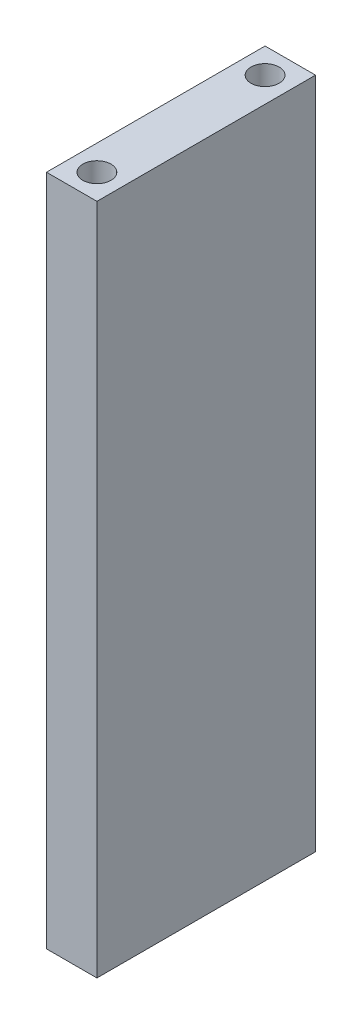
ISO-10303-21;
HEADER;
FILE_DESCRIPTION(('STEP AP214'),'2;1');
FILE_NAME('part.step','',(''),(''),'','','');
FILE_SCHEMA(('AUTOMOTIVE_DESIGN { 1 0 10303 214 1 1 1 1 }'));
ENDSEC;
DATA;
#1=APPLICATION_CONTEXT('core data for automotive mechanical design processes');
#2=APPLICATION_PROTOCOL_DEFINITION('international standard','automotive_design',2000,#1);
#3=PRODUCT_CONTEXT('',#1,'mechanical');
#4=PRODUCT('Part','Part','',(#3));
#5=PRODUCT_RELATED_PRODUCT_CATEGORY('part','',(#4));
#6=PRODUCT_DEFINITION_FORMATION('','',#4);
#7=PRODUCT_DEFINITION_CONTEXT('part definition',#1,'design');
#8=PRODUCT_DEFINITION('design','',#6,#7);
#9=PRODUCT_DEFINITION_SHAPE('','',#8);
#10=(LENGTH_UNIT() NAMED_UNIT(*) SI_UNIT(.MILLI.,.METRE.));
#11=(NAMED_UNIT(*) PLANE_ANGLE_UNIT() SI_UNIT($,.RADIAN.));
#12=(NAMED_UNIT(*) SI_UNIT($,.STERADIAN.) SOLID_ANGLE_UNIT());
#13=UNCERTAINTY_MEASURE_WITH_UNIT(LENGTH_MEASURE(1.E-05),#10,'distance_accuracy_value','');
#14=(GEOMETRIC_REPRESENTATION_CONTEXT(3) GLOBAL_UNCERTAINTY_ASSIGNED_CONTEXT((#13)) GLOBAL_UNIT_ASSIGNED_CONTEXT((#10,
#11,#12)) REPRESENTATION_CONTEXT('',''));
#15=CARTESIAN_POINT('',(0.,0.,0.));
#16=DIRECTION('',(0.,0.,1.));
#17=DIRECTION('',(1.,0.,0.));
#18=AXIS2_PLACEMENT_3D('',#15,#16,#17);
#19=CARTESIAN_POINT('',(0.,50.8,0.));
#20=DIRECTION('',(0.,-1.,0.));
#21=DIRECTION('',(0.,0.,-1.));
#22=AXIS2_PLACEMENT_3D('',#19,#20,#21);
#23=PLANE('',#22);
#24=DIRECTION('',(0.,0.,-1.));
#25=VECTOR('',#24,1.);
#26=CARTESIAN_POINT('',(-138.228308123733,50.8,35.7975));
#27=LINE('',#26,#25);
#28=CARTESIAN_POINT('',(-138.228308123733,50.8,35.7975));
#29=VERTEX_POINT('',#28);
#30=CARTESIAN_POINT('',(-138.228308123733,50.8,2.77750000000004));
#31=VERTEX_POINT('',#30);
#32=EDGE_CURVE('E86',#29,#31,#27,.T.);
#33=ORIENTED_EDGE('',*,*,#32,.T.);
#34=DIRECTION('',(-1.,0.,0.));
#35=VECTOR('',#34,1.);
#36=CARTESIAN_POINT('',(-145.848308123733,50.8,2.77750000000004));
#37=LINE('',#36,#35);
#38=CARTESIAN_POINT('',(-145.848308123733,50.8,2.77750000000004));
#39=VERTEX_POINT('',#38);
#40=EDGE_CURVE('E81',#31,#39,#37,.T.);
#41=ORIENTED_EDGE('',*,*,#40,.T.);
#42=DIRECTION('',(0.,0.,1.));
#43=VECTOR('',#42,1.);
#44=CARTESIAN_POINT('',(-145.848308123733,50.8,35.7975));
#45=LINE('',#44,#43);
#46=CARTESIAN_POINT('',(-145.848308123733,50.8,35.7975));
#47=VERTEX_POINT('',#46);
#48=EDGE_CURVE('E84',#39,#47,#45,.T.);
#49=ORIENTED_EDGE('',*,*,#48,.T.);
#50=DIRECTION('',(1.,0.,0.));
#51=VECTOR('',#50,1.);
#52=CARTESIAN_POINT('',(-145.848308123733,50.8,35.7975));
#53=LINE('',#52,#51);
#54=EDGE_CURVE('E51',#47,#29,#53,.T.);
#55=ORIENTED_EDGE('',*,*,#54,.T.);
#56=EDGE_LOOP('',(#33,#41,#49,#55));
#57=FACE_BOUND('',#56,.T.);
#58=CARTESIAN_POINT('',(-142.038308123733,50.8,6.58749999999998));
#59=DIRECTION('',(0.,1.,0.));
#60=DIRECTION('',(0.,0.,1.));
#61=AXIS2_PLACEMENT_3D('',#58,#59,#60);
#62=CIRCLE('',#61,2.12725);
#63=CARTESIAN_POINT('',(-142.038308123733,50.8,8.71474999999998));
#64=VERTEX_POINT('',#63);
#65=EDGE_CURVE('E101',#64,#64,#62,.T.);
#66=ORIENTED_EDGE('',*,*,#65,.F.);
#67=EDGE_LOOP('',(#66));
#68=FACE_BOUND('',#67,.T.);
#69=CARTESIAN_POINT('',(-142.038308123733,50.8,31.9875));
#70=DIRECTION('',(0.,1.,0.));
#71=DIRECTION('',(0.,0.,1.));
#72=AXIS2_PLACEMENT_3D('',#69,#70,#71);
#73=CIRCLE('',#72,2.12725);
#74=CARTESIAN_POINT('',(-142.038308123733,50.8,34.11475));
#75=VERTEX_POINT('',#74);
#76=EDGE_CURVE('E116',#75,#75,#73,.T.);
#77=ORIENTED_EDGE('',*,*,#76,.F.);
#78=EDGE_LOOP('',(#77));
#79=FACE_BOUND('',#78,.T.);
#80=ADVANCED_FACE('F34',(#57,#68,#79),#23,.F.);
#81=CARTESIAN_POINT('',(0.,-50.8,0.));
#82=DIRECTION('',(0.,-1.,0.));
#83=DIRECTION('',(0.,0.,-1.));
#84=AXIS2_PLACEMENT_3D('',#81,#82,#83);
#85=PLANE('',#84);
#86=CARTESIAN_POINT('',(-142.038308123733,-50.8,6.58749999999998));
#87=DIRECTION('',(0.,1.,0.));
#88=DIRECTION('',(0.,0.,1.));
#89=AXIS2_PLACEMENT_3D('',#86,#87,#88);
#90=CIRCLE('',#89,2.12725);
#91=CARTESIAN_POINT('',(-142.038308123733,-50.8,8.71474999999998));
#92=VERTEX_POINT('',#91);
#93=EDGE_CURVE('E113',#92,#92,#90,.T.);
#94=ORIENTED_EDGE('',*,*,#93,.T.);
#95=EDGE_LOOP('',(#94));
#96=FACE_BOUND('',#95,.T.);
#97=DIRECTION('',(0.,0.,-1.));
#98=VECTOR('',#97,1.);
#99=CARTESIAN_POINT('',(-138.228308123733,-50.8,35.7975));
#100=LINE('',#99,#98);
#101=CARTESIAN_POINT('',(-138.228308123733,-50.8,35.7975));
#102=VERTEX_POINT('',#101);
#103=CARTESIAN_POINT('',(-138.228308123733,-50.8,2.77750000000004));
#104=VERTEX_POINT('',#103);
#105=EDGE_CURVE('E98',#102,#104,#100,.T.);
#106=ORIENTED_EDGE('',*,*,#105,.F.);
#107=DIRECTION('',(1.,0.,0.));
#108=VECTOR('',#107,1.);
#109=CARTESIAN_POINT('',(-145.848308123733,-50.8,35.7975));
#110=LINE('',#109,#108);
#111=CARTESIAN_POINT('',(-145.848308123733,-50.8,35.7975));
#112=VERTEX_POINT('',#111);
#113=EDGE_CURVE('E74',#112,#102,#110,.T.);
#114=ORIENTED_EDGE('',*,*,#113,.F.);
#115=DIRECTION('',(0.,0.,1.));
#116=VECTOR('',#115,1.);
#117=CARTESIAN_POINT('',(-145.848308123733,-50.8,35.7975));
#118=LINE('',#117,#116);
#119=CARTESIAN_POINT('',(-145.848308123733,-50.8,2.77750000000004));
#120=VERTEX_POINT('',#119);
#121=EDGE_CURVE('E68',#120,#112,#118,.T.);
#122=ORIENTED_EDGE('',*,*,#121,.F.);
#123=DIRECTION('',(-1.,0.,0.));
#124=VECTOR('',#123,1.);
#125=CARTESIAN_POINT('',(-145.848308123733,-50.8,2.77750000000004));
#126=LINE('',#125,#124);
#127=EDGE_CURVE('E90',#104,#120,#126,.T.);
#128=ORIENTED_EDGE('',*,*,#127,.F.);
#129=EDGE_LOOP('',(#106,#114,#122,#128));
#130=FACE_BOUND('',#129,.T.);
#131=CARTESIAN_POINT('',(-142.038308123733,-50.8,31.9875));
#132=DIRECTION('',(0.,1.,0.));
#133=DIRECTION('',(0.,0.,1.));
#134=AXIS2_PLACEMENT_3D('',#131,#132,#133);
#135=CIRCLE('',#134,2.12725);
#136=CARTESIAN_POINT('',(-142.038308123733,-50.8,34.11475));
#137=VERTEX_POINT('',#136);
#138=EDGE_CURVE('E119',#137,#137,#135,.T.);
#139=ORIENTED_EDGE('',*,*,#138,.T.);
#140=EDGE_LOOP('',(#139));
#141=FACE_BOUND('',#140,.T.);
#142=ADVANCED_FACE('F109',(#96,#130,#141),#85,.T.);
#143=CARTESIAN_POINT('',(-138.228308123733,50.8,35.7975));
#144=DIRECTION('',(-1.,0.,0.));
#145=DIRECTION('',(0.,0.,1.));
#146=AXIS2_PLACEMENT_3D('',#143,#144,#145);
#147=PLANE('',#146);
#148=ORIENTED_EDGE('',*,*,#105,.T.);
#149=DIRECTION('',(0.,-1.,0.));
#150=VECTOR('',#149,1.);
#151=CARTESIAN_POINT('',(-138.228308123733,50.8,2.77750000000004));
#152=LINE('',#151,#150);
#153=EDGE_CURVE('E11',#31,#104,#152,.T.);
#154=ORIENTED_EDGE('',*,*,#153,.F.);
#155=ORIENTED_EDGE('',*,*,#32,.F.);
#156=DIRECTION('',(0.,-1.,0.));
#157=VECTOR('',#156,1.);
#158=CARTESIAN_POINT('',(-138.228308123733,50.8,35.7975));
#159=LINE('',#158,#157);
#160=EDGE_CURVE('E94',#29,#102,#159,.T.);
#161=ORIENTED_EDGE('',*,*,#160,.T.);
#162=EDGE_LOOP('',(#148,#154,#155,#161));
#163=FACE_BOUND('',#162,.T.);
#164=ADVANCED_FACE('F36',(#163),#147,.F.);
#165=CARTESIAN_POINT('',(-145.848308123733,50.8,2.77750000000004));
#166=DIRECTION('',(0.,0.,1.));
#167=DIRECTION('',(1.,0.,0.));
#168=AXIS2_PLACEMENT_3D('',#165,#166,#167);
#169=PLANE('',#168);
#170=ORIENTED_EDGE('',*,*,#127,.T.);
#171=DIRECTION('',(0.,-1.,0.));
#172=VECTOR('',#171,1.);
#173=CARTESIAN_POINT('',(-145.848308123733,50.8,2.77750000000004));
#174=LINE('',#173,#172);
#175=EDGE_CURVE('E43',#39,#120,#174,.T.);
#176=ORIENTED_EDGE('',*,*,#175,.F.);
#177=ORIENTED_EDGE('',*,*,#40,.F.);
#178=ORIENTED_EDGE('',*,*,#153,.T.);
#179=EDGE_LOOP('',(#170,#176,#177,#178));
#180=FACE_BOUND('',#179,.T.);
#181=ADVANCED_FACE('F89',(#180),#169,.F.);
#182=CARTESIAN_POINT('',(-145.848308123733,50.8,35.7975));
#183=DIRECTION('',(1.,0.,0.));
#184=DIRECTION('',(0.,0.,-1.));
#185=AXIS2_PLACEMENT_3D('',#182,#183,#184);
#186=PLANE('',#185);
#187=ORIENTED_EDGE('',*,*,#121,.T.);
#188=DIRECTION('',(0.,-1.,0.));
#189=VECTOR('',#188,1.);
#190=CARTESIAN_POINT('',(-145.848308123733,50.8,35.7975));
#191=LINE('',#190,#189);
#192=EDGE_CURVE('E91',#47,#112,#191,.T.);
#193=ORIENTED_EDGE('',*,*,#192,.F.);
#194=ORIENTED_EDGE('',*,*,#48,.F.);
#195=ORIENTED_EDGE('',*,*,#175,.T.);
#196=EDGE_LOOP('',(#187,#193,#194,#195));
#197=FACE_BOUND('',#196,.T.);
#198=ADVANCED_FACE('F92',(#197),#186,.F.);
#199=CARTESIAN_POINT('',(-145.848308123733,50.8,35.7975));
#200=DIRECTION('',(0.,0.,-1.));
#201=DIRECTION('',(-1.,0.,0.));
#202=AXIS2_PLACEMENT_3D('',#199,#200,#201);
#203=PLANE('',#202);
#204=ORIENTED_EDGE('',*,*,#113,.T.);
#205=ORIENTED_EDGE('',*,*,#160,.F.);
#206=ORIENTED_EDGE('',*,*,#54,.F.);
#207=ORIENTED_EDGE('',*,*,#192,.T.);
#208=EDGE_LOOP('',(#204,#205,#206,#207));
#209=FACE_BOUND('',#208,.T.);
#210=ADVANCED_FACE('F106',(#209),#203,.F.);
#211=CARTESIAN_POINT('',(-142.038308123733,50.8,6.58749999999998));
#212=DIRECTION('',(0.,-1.,0.));
#213=DIRECTION('',(0.,0.,-1.));
#214=AXIS2_PLACEMENT_3D('',#211,#212,#213);
#215=CYLINDRICAL_SURFACE('',#214,2.12725);
#216=ORIENTED_EDGE('',*,*,#65,.T.);
#217=EDGE_LOOP('',(#216));
#218=FACE_BOUND('',#217,.T.);
#219=ORIENTED_EDGE('',*,*,#93,.F.);
#220=EDGE_LOOP('',(#219));
#221=FACE_BOUND('',#220,.T.);
#222=ADVANCED_FACE('F136',(#218,#221),#215,.F.);
#223=CARTESIAN_POINT('',(-142.038308123733,50.8,31.9875));
#224=DIRECTION('',(0.,-1.,0.));
#225=DIRECTION('',(0.,0.,-1.));
#226=AXIS2_PLACEMENT_3D('',#223,#224,#225);
#227=CYLINDRICAL_SURFACE('',#226,2.12725);
#228=ORIENTED_EDGE('',*,*,#76,.T.);
#229=EDGE_LOOP('',(#228));
#230=FACE_BOUND('',#229,.T.);
#231=ORIENTED_EDGE('',*,*,#138,.F.);
#232=EDGE_LOOP('',(#231));
#233=FACE_BOUND('',#232,.T.);
#234=ADVANCED_FACE('F125',(#230,#233),#227,.F.);
#235=CLOSED_SHELL('',(#80,#142,#164,#181,#198,#210,#222,#234));
#236=MANIFOLD_SOLID_BREP('B2',#235);
#237=ADVANCED_BREP_SHAPE_REPRESENTATION('',(#18,#236),#14);
#238=SHAPE_DEFINITION_REPRESENTATION(#9,#237);
ENDSEC;
END-ISO-10303-21;
